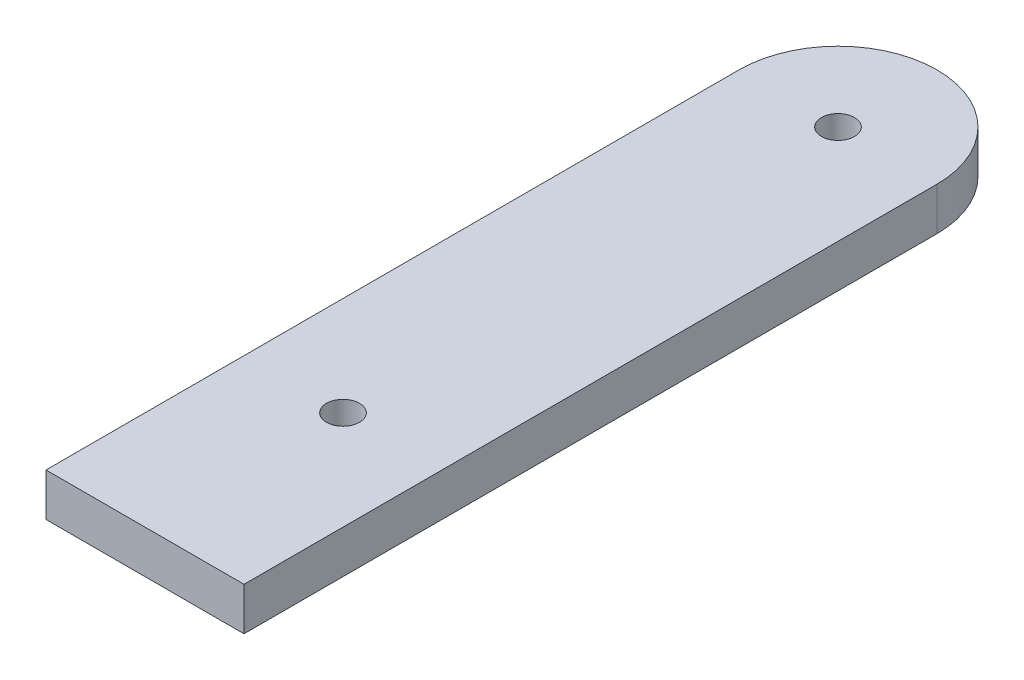
ISO-10303-21;
HEADER;
FILE_DESCRIPTION(('STEP AP214'),'2;1');
FILE_NAME('part.step','',(''),(''),'','','');
FILE_SCHEMA(('AUTOMOTIVE_DESIGN { 1 0 10303 214 1 1 1 1 }'));
ENDSEC;
DATA;
#1=APPLICATION_CONTEXT('core data for automotive mechanical design processes');
#2=APPLICATION_PROTOCOL_DEFINITION('international standard','automotive_design',2000,#1);
#3=PRODUCT_CONTEXT('',#1,'mechanical');
#4=PRODUCT('Part','Part','',(#3));
#5=PRODUCT_RELATED_PRODUCT_CATEGORY('part','',(#4));
#6=PRODUCT_DEFINITION_FORMATION('','',#4);
#7=PRODUCT_DEFINITION_CONTEXT('part definition',#1,'design');
#8=PRODUCT_DEFINITION('design','',#6,#7);
#9=PRODUCT_DEFINITION_SHAPE('','',#8);
#10=(LENGTH_UNIT() NAMED_UNIT(*) SI_UNIT(.MILLI.,.METRE.));
#11=(NAMED_UNIT(*) PLANE_ANGLE_UNIT() SI_UNIT($,.RADIAN.));
#12=(NAMED_UNIT(*) SI_UNIT($,.STERADIAN.) SOLID_ANGLE_UNIT());
#13=UNCERTAINTY_MEASURE_WITH_UNIT(LENGTH_MEASURE(1.E-05),#10,'distance_accuracy_value','');
#14=(GEOMETRIC_REPRESENTATION_CONTEXT(3) GLOBAL_UNCERTAINTY_ASSIGNED_CONTEXT((#13)) GLOBAL_UNIT_ASSIGNED_CONTEXT((#10,
#11,#12)) REPRESENTATION_CONTEXT('',''));
#15=CARTESIAN_POINT('',(0.,0.,0.));
#16=DIRECTION('',(0.,0.,1.));
#17=DIRECTION('',(1.,0.,0.));
#18=AXIS2_PLACEMENT_3D('',#15,#16,#17);
#19=CARTESIAN_POINT('',(0.,6.5,0.));
#20=DIRECTION('',(0.,-1.,0.));
#21=DIRECTION('',(0.,0.,-1.));
#22=AXIS2_PLACEMENT_3D('',#19,#20,#21);
#23=PLANE('',#22);
#24=CARTESIAN_POINT('',(15.,6.5,-30.));
#25=DIRECTION('',(0.,1.,0.));
#26=DIRECTION('',(0.,0.,1.));
#27=AXIS2_PLACEMENT_3D('',#24,#25,#26);
#28=CIRCLE('',#27,2.5);
#29=CARTESIAN_POINT('',(15.,6.5,-32.5));
#30=VERTEX_POINT('',#29);
#31=EDGE_CURVE('E120',#30,#30,#28,.T.);
#32=ORIENTED_EDGE('',*,*,#31,.F.);
#33=EDGE_LOOP('',(#32));
#34=FACE_BOUND('',#33,.T.);
#35=DIRECTION('',(0.,0.,-1.));
#36=VECTOR('',#35,1.);
#37=CARTESIAN_POINT('',(30.,6.5,0.));
#38=LINE('',#37,#36);
#39=CARTESIAN_POINT('',(30.,6.5,0.));
#40=VERTEX_POINT('',#39);
#41=CARTESIAN_POINT('',(30.,6.5,-105.));
#42=VERTEX_POINT('',#41);
#43=EDGE_CURVE('E91',#40,#42,#38,.T.);
#44=ORIENTED_EDGE('',*,*,#43,.T.);
#45=CARTESIAN_POINT('',(15.,6.5,-105.));
#46=DIRECTION('',(0.,-1.,0.));
#47=DIRECTION('',(0.,0.,-1.));
#48=AXIS2_PLACEMENT_3D('',#45,#46,#47);
#49=CIRCLE('',#48,15.);
#50=CARTESIAN_POINT('',(15.,6.5,-120.));
#51=VERTEX_POINT('',#50);
#52=EDGE_CURVE('E42',#42,#51,#49,.F.);
#53=ORIENTED_EDGE('',*,*,#52,.T.);
#54=CARTESIAN_POINT('',(15.,6.5,-105.));
#55=DIRECTION('',(0.,-1.,0.));
#56=DIRECTION('',(0.,0.,-1.));
#57=AXIS2_PLACEMENT_3D('',#54,#55,#56);
#58=CIRCLE('',#57,15.);
#59=CARTESIAN_POINT('',(0.,6.5,-105.));
#60=VERTEX_POINT('',#59);
#61=EDGE_CURVE('E52',#51,#60,#58,.F.);
#62=ORIENTED_EDGE('',*,*,#61,.T.);
#63=DIRECTION('',(0.,0.,1.));
#64=VECTOR('',#63,1.);
#65=CARTESIAN_POINT('',(0.,6.5,0.));
#66=LINE('',#65,#64);
#67=CARTESIAN_POINT('',(0.,6.5,0.));
#68=VERTEX_POINT('',#67);
#69=EDGE_CURVE('E74',#60,#68,#66,.T.);
#70=ORIENTED_EDGE('',*,*,#69,.T.);
#71=DIRECTION('',(1.,0.,0.));
#72=VECTOR('',#71,1.);
#73=CARTESIAN_POINT('',(0.,6.5,0.));
#74=LINE('',#73,#72);
#75=EDGE_CURVE('E77',#68,#40,#74,.T.);
#76=ORIENTED_EDGE('',*,*,#75,.T.);
#77=EDGE_LOOP('',(#44,#53,#62,#70,#76));
#78=FACE_BOUND('',#77,.T.);
#79=CARTESIAN_POINT('',(15.,6.5,-105.));
#80=DIRECTION('',(0.,1.,0.));
#81=DIRECTION('',(0.,0.,1.));
#82=AXIS2_PLACEMENT_3D('',#79,#80,#81);
#83=CIRCLE('',#82,2.5);
#84=CARTESIAN_POINT('',(15.,6.5,-107.5));
#85=VERTEX_POINT('',#84);
#86=EDGE_CURVE('E131',#85,#85,#83,.T.);
#87=ORIENTED_EDGE('',*,*,#86,.F.);
#88=EDGE_LOOP('',(#87));
#89=FACE_BOUND('',#88,.T.);
#90=ADVANCED_FACE('F33',(#34,#78,#89),#23,.F.);
#91=CARTESIAN_POINT('',(0.,0.,0.));
#92=DIRECTION('',(0.,-1.,0.));
#93=DIRECTION('',(0.,0.,-1.));
#94=AXIS2_PLACEMENT_3D('',#91,#92,#93);
#95=PLANE('',#94);
#96=CARTESIAN_POINT('',(15.,0.,-30.));
#97=DIRECTION('',(0.,1.,0.));
#98=DIRECTION('',(0.,0.,1.));
#99=AXIS2_PLACEMENT_3D('',#96,#97,#98);
#100=CIRCLE('',#99,2.5);
#101=CARTESIAN_POINT('',(15.,0.,-32.5));
#102=VERTEX_POINT('',#101);
#103=EDGE_CURVE('E135',#102,#102,#100,.T.);
#104=ORIENTED_EDGE('',*,*,#103,.T.);
#105=EDGE_LOOP('',(#104));
#106=FACE_BOUND('',#105,.T.);
#107=CARTESIAN_POINT('',(15.,0.,-105.));
#108=DIRECTION('',(0.,-1.,0.));
#109=DIRECTION('',(0.,0.,-1.));
#110=AXIS2_PLACEMENT_3D('',#107,#108,#109);
#111=CIRCLE('',#110,15.);
#112=CARTESIAN_POINT('',(0.,0.,-105.));
#113=VERTEX_POINT('',#112);
#114=CARTESIAN_POINT('',(15.,0.,-120.));
#115=VERTEX_POINT('',#114);
#116=EDGE_CURVE('E97',#113,#115,#111,.T.);
#117=ORIENTED_EDGE('',*,*,#116,.T.);
#118=CARTESIAN_POINT('',(15.,0.,-105.));
#119=DIRECTION('',(0.,-1.,0.));
#120=DIRECTION('',(0.,0.,-1.));
#121=AXIS2_PLACEMENT_3D('',#118,#119,#120);
#122=CIRCLE('',#121,15.);
#123=CARTESIAN_POINT('',(30.,0.,-105.));
#124=VERTEX_POINT('',#123);
#125=EDGE_CURVE('E99',#115,#124,#122,.T.);
#126=ORIENTED_EDGE('',*,*,#125,.T.);
#127=DIRECTION('',(0.,0.,-1.));
#128=VECTOR('',#127,1.);
#129=CARTESIAN_POINT('',(30.,0.,0.));
#130=LINE('',#129,#128);
#131=CARTESIAN_POINT('',(30.,0.,0.));
#132=VERTEX_POINT('',#131);
#133=EDGE_CURVE('E82',#132,#124,#130,.T.);
#134=ORIENTED_EDGE('',*,*,#133,.F.);
#135=DIRECTION('',(1.,0.,0.));
#136=VECTOR('',#135,1.);
#137=CARTESIAN_POINT('',(0.,0.,0.));
#138=LINE('',#137,#136);
#139=CARTESIAN_POINT('',(0.,0.,0.));
#140=VERTEX_POINT('',#139);
#141=EDGE_CURVE('E119',#140,#132,#138,.T.);
#142=ORIENTED_EDGE('',*,*,#141,.F.);
#143=DIRECTION('',(0.,0.,1.));
#144=VECTOR('',#143,1.);
#145=CARTESIAN_POINT('',(0.,0.,0.));
#146=LINE('',#145,#144);
#147=EDGE_CURVE('E95',#113,#140,#146,.T.);
#148=ORIENTED_EDGE('',*,*,#147,.F.);
#149=EDGE_LOOP('',(#117,#126,#134,#142,#148));
#150=FACE_BOUND('',#149,.T.);
#151=CARTESIAN_POINT('',(15.,0.,-105.));
#152=DIRECTION('',(0.,1.,0.));
#153=DIRECTION('',(0.,0.,1.));
#154=AXIS2_PLACEMENT_3D('',#151,#152,#153);
#155=CIRCLE('',#154,2.5);
#156=CARTESIAN_POINT('',(15.,0.,-107.5));
#157=VERTEX_POINT('',#156);
#158=EDGE_CURVE('E129',#157,#157,#155,.T.);
#159=ORIENTED_EDGE('',*,*,#158,.T.);
#160=EDGE_LOOP('',(#159));
#161=FACE_BOUND('',#160,.T.);
#162=ADVANCED_FACE('F122',(#106,#150,#161),#95,.T.);
#163=CARTESIAN_POINT('',(0.,6.5,0.));
#164=DIRECTION('',(1.,0.,0.));
#165=DIRECTION('',(0.,0.,-1.));
#166=AXIS2_PLACEMENT_3D('',#163,#164,#165);
#167=PLANE('',#166);
#168=ORIENTED_EDGE('',*,*,#69,.F.);
#169=DIRECTION('',(0.,-1.,0.));
#170=VECTOR('',#169,1.);
#171=CARTESIAN_POINT('',(0.,6.5,-105.));
#172=LINE('',#171,#170);
#173=EDGE_CURVE('E11',#60,#113,#172,.T.);
#174=ORIENTED_EDGE('',*,*,#173,.T.);
#175=ORIENTED_EDGE('',*,*,#147,.T.);
#176=DIRECTION('',(0.,-1.,0.));
#177=VECTOR('',#176,1.);
#178=CARTESIAN_POINT('',(0.,6.5,0.));
#179=LINE('',#178,#177);
#180=EDGE_CURVE('E87',#68,#140,#179,.T.);
#181=ORIENTED_EDGE('',*,*,#180,.F.);
#182=EDGE_LOOP('',(#168,#174,#175,#181));
#183=FACE_BOUND('',#182,.T.);
#184=ADVANCED_FACE('F93',(#183),#167,.F.);
#185=CARTESIAN_POINT('',(0.,6.5,0.));
#186=DIRECTION('',(0.,0.,-1.));
#187=DIRECTION('',(-1.,0.,0.));
#188=AXIS2_PLACEMENT_3D('',#185,#186,#187);
#189=PLANE('',#188);
#190=ORIENTED_EDGE('',*,*,#141,.T.);
#191=DIRECTION('',(0.,-1.,0.));
#192=VECTOR('',#191,1.);
#193=CARTESIAN_POINT('',(30.,6.5,0.));
#194=LINE('',#193,#192);
#195=EDGE_CURVE('E89',#40,#132,#194,.T.);
#196=ORIENTED_EDGE('',*,*,#195,.F.);
#197=ORIENTED_EDGE('',*,*,#75,.F.);
#198=ORIENTED_EDGE('',*,*,#180,.T.);
#199=EDGE_LOOP('',(#190,#196,#197,#198));
#200=FACE_BOUND('',#199,.T.);
#201=ADVANCED_FACE('F86',(#200),#189,.F.);
#202=CARTESIAN_POINT('',(30.,6.5,0.));
#203=DIRECTION('',(-1.,0.,0.));
#204=DIRECTION('',(0.,0.,1.));
#205=AXIS2_PLACEMENT_3D('',#202,#203,#204);
#206=PLANE('',#205);
#207=ORIENTED_EDGE('',*,*,#133,.T.);
#208=DIRECTION('',(0.,-1.,0.));
#209=VECTOR('',#208,1.);
#210=CARTESIAN_POINT('',(30.,6.5,-105.));
#211=LINE('',#210,#209);
#212=EDGE_CURVE('E105',#124,#42,#211,.F.);
#213=ORIENTED_EDGE('',*,*,#212,.T.);
#214=ORIENTED_EDGE('',*,*,#43,.F.);
#215=ORIENTED_EDGE('',*,*,#195,.T.);
#216=EDGE_LOOP('',(#207,#213,#214,#215));
#217=FACE_BOUND('',#216,.T.);
#218=ADVANCED_FACE('F112',(#217),#206,.F.);
#219=CARTESIAN_POINT('',(15.,6.5,-30.));
#220=DIRECTION('',(0.,-1.,0.));
#221=DIRECTION('',(0.,0.,-1.));
#222=AXIS2_PLACEMENT_3D('',#219,#220,#221);
#223=CYLINDRICAL_SURFACE('',#222,2.5);
#224=CARTESIAN_POINT('',(15.,6.5,-32.5));
#225=CARTESIAN_POINT('',(15.,6.43229166666667,-32.5));
#226=CARTESIAN_POINT('',(15.,6.36458333333333,-32.5));
#227=CARTESIAN_POINT('',(15.,6.22916666666667,-32.5));
#228=CARTESIAN_POINT('',(15.,6.16145833333333,-32.5));
#229=CARTESIAN_POINT('',(15.,6.02604166666667,-32.5));
#230=CARTESIAN_POINT('',(15.,5.95833333333333,-32.5));
#231=CARTESIAN_POINT('',(15.,5.82291666666667,-32.5));
#232=CARTESIAN_POINT('',(15.,5.75520833333333,-32.5));
#233=CARTESIAN_POINT('',(15.,5.61979166666667,-32.5));
#234=CARTESIAN_POINT('',(15.,5.55208333333333,-32.5));
#235=CARTESIAN_POINT('',(15.,5.41666666666667,-32.5));
#236=CARTESIAN_POINT('',(15.,5.34895833333333,-32.5));
#237=CARTESIAN_POINT('',(15.,5.21354166666667,-32.5));
#238=CARTESIAN_POINT('',(15.,5.14583333333333,-32.5));
#239=CARTESIAN_POINT('',(15.,5.01041666666667,-32.5));
#240=CARTESIAN_POINT('',(15.,4.94270833333333,-32.5));
#241=CARTESIAN_POINT('',(15.,4.80729166666667,-32.5));
#242=CARTESIAN_POINT('',(15.,4.73958333333333,-32.5));
#243=CARTESIAN_POINT('',(15.,4.60416666666667,-32.5));
#244=CARTESIAN_POINT('',(15.,4.53645833333333,-32.5));
#245=CARTESIAN_POINT('',(15.,4.40104166666667,-32.5));
#246=CARTESIAN_POINT('',(15.,4.33333333333333,-32.5));
#247=CARTESIAN_POINT('',(15.,4.19791666666667,-32.5));
#248=CARTESIAN_POINT('',(15.,4.13020833333333,-32.5));
#249=CARTESIAN_POINT('',(15.,3.99479166666667,-32.5));
#250=CARTESIAN_POINT('',(15.,3.92708333333333,-32.5));
#251=CARTESIAN_POINT('',(15.,3.79166666666667,-32.5));
#252=CARTESIAN_POINT('',(15.,3.72395833333333,-32.5));
#253=CARTESIAN_POINT('',(15.,3.58854166666667,-32.5));
#254=CARTESIAN_POINT('',(15.,3.52083333333333,-32.5));
#255=CARTESIAN_POINT('',(15.,3.38541666666667,-32.5));
#256=CARTESIAN_POINT('',(15.,3.31770833333333,-32.5));
#257=CARTESIAN_POINT('',(15.,3.18229166666667,-32.5));
#258=CARTESIAN_POINT('',(15.,3.11458333333333,-32.5));
#259=CARTESIAN_POINT('',(15.,2.97916666666667,-32.5));
#260=CARTESIAN_POINT('',(15.,2.91145833333333,-32.5));
#261=CARTESIAN_POINT('',(15.,2.77604166666667,-32.5));
#262=CARTESIAN_POINT('',(15.,2.70833333333333,-32.5));
#263=CARTESIAN_POINT('',(15.,2.57291666666667,-32.5));
#264=CARTESIAN_POINT('',(15.,2.50520833333333,-32.5));
#265=CARTESIAN_POINT('',(15.,2.36979166666667,-32.5));
#266=CARTESIAN_POINT('',(15.,2.30208333333333,-32.5));
#267=CARTESIAN_POINT('',(15.,2.16666666666667,-32.5));
#268=CARTESIAN_POINT('',(15.,2.09895833333333,-32.5));
#269=CARTESIAN_POINT('',(15.,1.96354166666667,-32.5));
#270=CARTESIAN_POINT('',(15.,1.89583333333333,-32.5));
#271=CARTESIAN_POINT('',(15.,1.76041666666667,-32.5));
#272=CARTESIAN_POINT('',(15.,1.69270833333333,-32.5));
#273=CARTESIAN_POINT('',(15.,1.55729166666667,-32.5));
#274=CARTESIAN_POINT('',(15.,1.48958333333333,-32.5));
#275=CARTESIAN_POINT('',(15.,1.35416666666667,-32.5));
#276=CARTESIAN_POINT('',(15.,1.28645833333333,-32.5));
#277=CARTESIAN_POINT('',(15.,1.15104166666667,-32.5));
#278=CARTESIAN_POINT('',(15.,1.08333333333333,-32.5));
#279=CARTESIAN_POINT('',(15.,0.947916666666667,-32.5));
#280=CARTESIAN_POINT('',(15.,0.880208333333333,-32.5));
#281=CARTESIAN_POINT('',(15.,0.744791666666667,-32.5));
#282=CARTESIAN_POINT('',(15.,0.677083333333333,-32.5));
#283=CARTESIAN_POINT('',(15.,0.541666666666667,-32.5));
#284=CARTESIAN_POINT('',(15.,0.473958333333333,-32.5));
#285=CARTESIAN_POINT('',(15.,0.338541666666667,-32.5));
#286=CARTESIAN_POINT('',(15.,0.270833333333334,-32.5));
#287=CARTESIAN_POINT('',(15.,0.135416666666667,-32.5));
#288=CARTESIAN_POINT('',(15.,0.0677083333333334,-32.5));
#289=CARTESIAN_POINT('',(15.,0.,-32.5));
#290=B_SPLINE_CURVE_WITH_KNOTS('',3,(#224,#225,#226,#227,#228,#229,#230,#231,#232,#233,#234,
#235,#236,#237,#238,#239,#240,#241,#242,#243,#244,#245,#246,#247,#248,#249,#250,#251,#252,#253,
#254,#255,#256,#257,#258,#259,#260,#261,#262,#263,#264,#265,#266,#267,#268,#269,#270,#271,#272,
#273,#274,#275,#276,#277,#278,#279,#280,#281,#282,#283,#284,#285,#286,#287,#288,#289),
.UNSPECIFIED.,.F.,.F.,(4,2,2,2,2,2,2,2,2,2,2,2,2,2,2,2,2,2,2,2,2,2,2,2,2,2,2,2,2,2,2,2,4),(0.,
0.203124999999999,0.40625,0.609375,0.812499999999999,1.015625,1.21875,1.421875,1.625,1.828125,
2.03125,2.234375,2.4375,2.640625,2.84375,3.046875,3.25,3.453125,3.65625,3.859375,4.0625,
4.265625,4.46875,4.671875,4.875,5.078125,5.28125,5.484375,5.6875,5.890625,6.09375,6.296875,6.5),.UNSPECIFIED.);
#291=EDGE_CURVE('BSEAM144',#30,#102,#290,.T.);
#292=ORIENTED_EDGE('',*,*,#31,.T.);
#293=ORIENTED_EDGE('',*,*,#103,.F.);
#294=ORIENTED_EDGE('',*,*,#291,.T.);
#295=ORIENTED_EDGE('',*,*,#291,.F.);
#296=EDGE_LOOP('',(#292,#294,#293,#295));
#297=FACE_BOUND('',#296,.T.);
#298=ADVANCED_FACE('F144',(#297),#223,.F.);
#299=CARTESIAN_POINT('',(15.,6.5,-105.));
#300=DIRECTION('',(0.,-1.,0.));
#301=DIRECTION('',(0.,0.,-1.));
#302=AXIS2_PLACEMENT_3D('',#299,#300,#301);
#303=CYLINDRICAL_SURFACE('',#302,2.5);
#304=CARTESIAN_POINT('',(15.,6.5,-107.5));
#305=CARTESIAN_POINT('',(15.,6.43229166666667,-107.5));
#306=CARTESIAN_POINT('',(15.,6.36458333333333,-107.5));
#307=CARTESIAN_POINT('',(15.,6.22916666666667,-107.5));
#308=CARTESIAN_POINT('',(15.,6.16145833333333,-107.5));
#309=CARTESIAN_POINT('',(15.,6.02604166666667,-107.5));
#310=CARTESIAN_POINT('',(15.,5.95833333333333,-107.5));
#311=CARTESIAN_POINT('',(15.,5.82291666666667,-107.5));
#312=CARTESIAN_POINT('',(15.,5.75520833333333,-107.5));
#313=CARTESIAN_POINT('',(15.,5.61979166666667,-107.5));
#314=CARTESIAN_POINT('',(15.,5.55208333333333,-107.5));
#315=CARTESIAN_POINT('',(15.,5.41666666666667,-107.5));
#316=CARTESIAN_POINT('',(15.,5.34895833333333,-107.5));
#317=CARTESIAN_POINT('',(15.,5.21354166666667,-107.5));
#318=CARTESIAN_POINT('',(15.,5.14583333333333,-107.5));
#319=CARTESIAN_POINT('',(15.,5.01041666666667,-107.5));
#320=CARTESIAN_POINT('',(15.,4.94270833333333,-107.5));
#321=CARTESIAN_POINT('',(15.,4.80729166666667,-107.5));
#322=CARTESIAN_POINT('',(15.,4.73958333333333,-107.5));
#323=CARTESIAN_POINT('',(15.,4.60416666666667,-107.5));
#324=CARTESIAN_POINT('',(15.,4.53645833333333,-107.5));
#325=CARTESIAN_POINT('',(15.,4.40104166666667,-107.5));
#326=CARTESIAN_POINT('',(15.,4.33333333333333,-107.5));
#327=CARTESIAN_POINT('',(15.,4.19791666666667,-107.5));
#328=CARTESIAN_POINT('',(15.,4.13020833333333,-107.5));
#329=CARTESIAN_POINT('',(15.,3.99479166666667,-107.5));
#330=CARTESIAN_POINT('',(15.,3.92708333333333,-107.5));
#331=CARTESIAN_POINT('',(15.,3.79166666666667,-107.5));
#332=CARTESIAN_POINT('',(15.,3.72395833333333,-107.5));
#333=CARTESIAN_POINT('',(15.,3.58854166666667,-107.5));
#334=CARTESIAN_POINT('',(15.,3.52083333333333,-107.5));
#335=CARTESIAN_POINT('',(15.,3.38541666666667,-107.5));
#336=CARTESIAN_POINT('',(15.,3.31770833333333,-107.5));
#337=CARTESIAN_POINT('',(15.,3.18229166666667,-107.5));
#338=CARTESIAN_POINT('',(15.,3.11458333333333,-107.5));
#339=CARTESIAN_POINT('',(15.,2.97916666666667,-107.5));
#340=CARTESIAN_POINT('',(15.,2.91145833333333,-107.5));
#341=CARTESIAN_POINT('',(15.,2.77604166666667,-107.5));
#342=CARTESIAN_POINT('',(15.,2.70833333333333,-107.5));
#343=CARTESIAN_POINT('',(15.,2.57291666666667,-107.5));
#344=CARTESIAN_POINT('',(15.,2.50520833333333,-107.5));
#345=CARTESIAN_POINT('',(15.,2.36979166666667,-107.5));
#346=CARTESIAN_POINT('',(15.,2.30208333333333,-107.5));
#347=CARTESIAN_POINT('',(15.,2.16666666666667,-107.5));
#348=CARTESIAN_POINT('',(15.,2.09895833333333,-107.5));
#349=CARTESIAN_POINT('',(15.,1.96354166666667,-107.5));
#350=CARTESIAN_POINT('',(15.,1.89583333333333,-107.5));
#351=CARTESIAN_POINT('',(15.,1.76041666666667,-107.5));
#352=CARTESIAN_POINT('',(15.,1.69270833333333,-107.5));
#353=CARTESIAN_POINT('',(15.,1.55729166666667,-107.5));
#354=CARTESIAN_POINT('',(15.,1.48958333333333,-107.5));
#355=CARTESIAN_POINT('',(15.,1.35416666666667,-107.5));
#356=CARTESIAN_POINT('',(15.,1.28645833333333,-107.5));
#357=CARTESIAN_POINT('',(15.,1.15104166666667,-107.5));
#358=CARTESIAN_POINT('',(15.,1.08333333333333,-107.5));
#359=CARTESIAN_POINT('',(15.,0.947916666666667,-107.5));
#360=CARTESIAN_POINT('',(15.,0.880208333333333,-107.5));
#361=CARTESIAN_POINT('',(15.,0.744791666666667,-107.5));
#362=CARTESIAN_POINT('',(15.,0.677083333333333,-107.5));
#363=CARTESIAN_POINT('',(15.,0.541666666666667,-107.5));
#364=CARTESIAN_POINT('',(15.,0.473958333333333,-107.5));
#365=CARTESIAN_POINT('',(15.,0.338541666666667,-107.5));
#366=CARTESIAN_POINT('',(15.,0.270833333333334,-107.5));
#367=CARTESIAN_POINT('',(15.,0.135416666666667,-107.5));
#368=CARTESIAN_POINT('',(15.,0.0677083333333334,-107.5));
#369=CARTESIAN_POINT('',(15.,0.,-107.5));
#370=B_SPLINE_CURVE_WITH_KNOTS('',3,(#304,#305,#306,#307,#308,#309,#310,#311,#312,#313,#314,
#315,#316,#317,#318,#319,#320,#321,#322,#323,#324,#325,#326,#327,#328,#329,#330,#331,#332,#333,
#334,#335,#336,#337,#338,#339,#340,#341,#342,#343,#344,#345,#346,#347,#348,#349,#350,#351,#352,
#353,#354,#355,#356,#357,#358,#359,#360,#361,#362,#363,#364,#365,#366,#367,#368,#369),
.UNSPECIFIED.,.F.,.F.,(4,2,2,2,2,2,2,2,2,2,2,2,2,2,2,2,2,2,2,2,2,2,2,2,2,2,2,2,2,2,2,2,4),(0.,
0.203124999999999,0.40625,0.609375,0.812499999999999,1.015625,1.21875,1.421875,1.625,1.828125,
2.03125,2.234375,2.4375,2.640625,2.84375,3.046875,3.25,3.453125,3.65625,3.859375,4.0625,
4.265625,4.46875,4.671875,4.875,5.078125,5.28125,5.484375,5.6875,5.890625,6.09375,6.296875,6.5),.UNSPECIFIED.);
#371=EDGE_CURVE('BSEAM146',#85,#157,#370,.T.);
#372=ORIENTED_EDGE('',*,*,#86,.T.);
#373=ORIENTED_EDGE('',*,*,#158,.F.);
#374=ORIENTED_EDGE('',*,*,#371,.T.);
#375=ORIENTED_EDGE('',*,*,#371,.F.);
#376=EDGE_LOOP('',(#372,#374,#373,#375));
#377=FACE_BOUND('',#376,.T.);
#378=ADVANCED_FACE('F146',(#377),#303,.F.);
#379=CARTESIAN_POINT('',(15.,6.5,-105.));
#380=DIRECTION('',(0.,-1.,0.));
#381=DIRECTION('',(0.,0.,-1.));
#382=AXIS2_PLACEMENT_3D('',#379,#380,#381);
#383=CYLINDRICAL_SURFACE('',#382,15.);
#384=ORIENTED_EDGE('',*,*,#173,.F.);
#385=ORIENTED_EDGE('',*,*,#61,.F.);
#386=DIRECTION('',(0.,-1.,0.));
#387=VECTOR('',#386,1.);
#388=CARTESIAN_POINT('',(15.,6.5,-120.));
#389=LINE('',#388,#387);
#390=EDGE_CURVE('E37',#115,#51,#389,.F.);
#391=ORIENTED_EDGE('',*,*,#390,.F.);
#392=ORIENTED_EDGE('',*,*,#116,.F.);
#393=EDGE_LOOP('',(#384,#385,#391,#392));
#394=FACE_BOUND('',#393,.T.);
#395=ADVANCED_FACE('F35',(#394),#383,.T.);
#396=CARTESIAN_POINT('',(15.,6.5,-105.));
#397=DIRECTION('',(0.,-1.,0.));
#398=DIRECTION('',(0.,0.,-1.));
#399=AXIS2_PLACEMENT_3D('',#396,#397,#398);
#400=CYLINDRICAL_SURFACE('',#399,15.);
#401=ORIENTED_EDGE('',*,*,#52,.F.);
#402=ORIENTED_EDGE('',*,*,#212,.F.);
#403=ORIENTED_EDGE('',*,*,#125,.F.);
#404=ORIENTED_EDGE('',*,*,#390,.T.);
#405=EDGE_LOOP('',(#401,#402,#403,#404));
#406=FACE_BOUND('',#405,.T.);
#407=ADVANCED_FACE('F127',(#406),#400,.T.);
#408=CLOSED_SHELL('',(#90,#162,#184,#201,#218,#298,#378,#395,#407));
#409=MANIFOLD_SOLID_BREP('B2',#408);
#410=ADVANCED_BREP_SHAPE_REPRESENTATION('',(#18,#409),#14);
#411=SHAPE_DEFINITION_REPRESENTATION(#9,#410);
ENDSEC;
END-ISO-10303-21;
